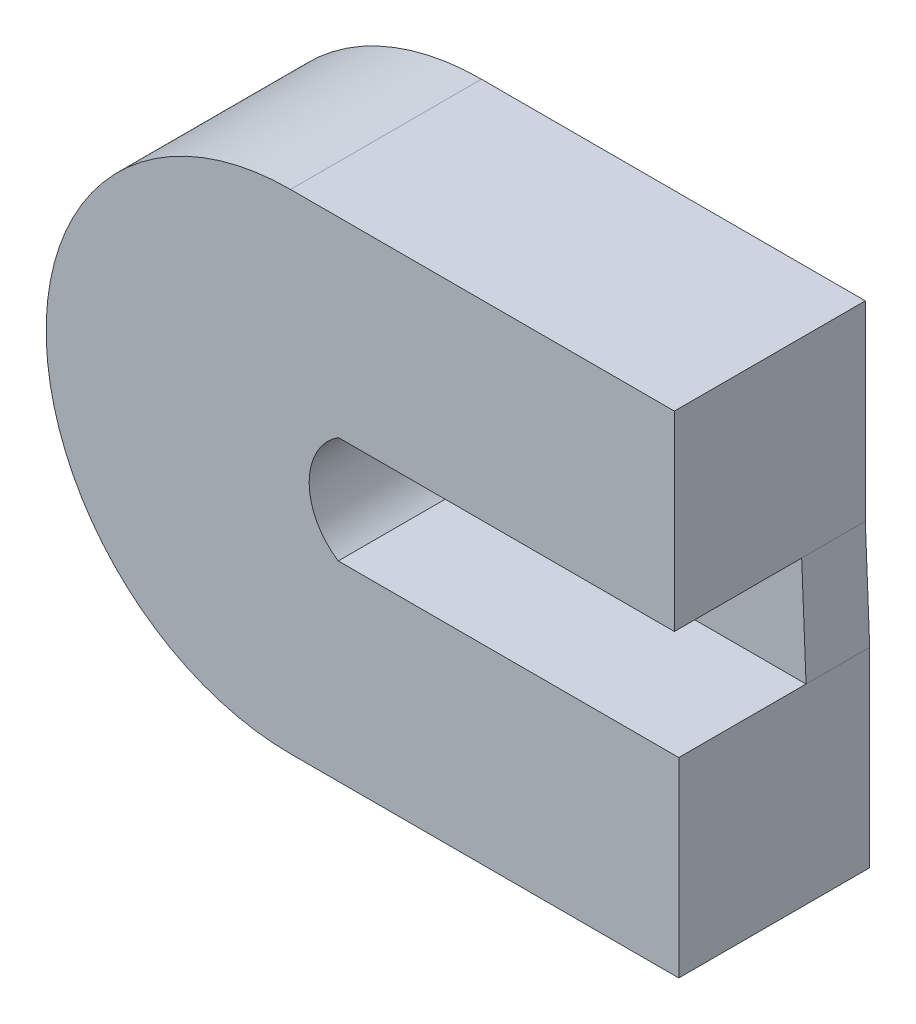
ISO-10303-21;
HEADER;
FILE_DESCRIPTION(('STEP AP214'),'2;1');
FILE_NAME('part.step','',(''),(''),'','','');
FILE_SCHEMA(('AUTOMOTIVE_DESIGN { 1 0 10303 214 1 1 1 1 }'));
ENDSEC;
DATA;
#1=APPLICATION_CONTEXT('core data for automotive mechanical design processes');
#2=APPLICATION_PROTOCOL_DEFINITION('international standard','automotive_design',2000,#1);
#3=PRODUCT_CONTEXT('',#1,'mechanical');
#4=PRODUCT('Part','Part','',(#3));
#5=PRODUCT_RELATED_PRODUCT_CATEGORY('part','',(#4));
#6=PRODUCT_DEFINITION_FORMATION('','',#4);
#7=PRODUCT_DEFINITION_CONTEXT('part definition',#1,'design');
#8=PRODUCT_DEFINITION('design','',#6,#7);
#9=PRODUCT_DEFINITION_SHAPE('','',#8);
#10=(LENGTH_UNIT() NAMED_UNIT(*) SI_UNIT(.MILLI.,.METRE.));
#11=(NAMED_UNIT(*) PLANE_ANGLE_UNIT() SI_UNIT($,.RADIAN.));
#12=(NAMED_UNIT(*) SI_UNIT($,.STERADIAN.) SOLID_ANGLE_UNIT());
#13=UNCERTAINTY_MEASURE_WITH_UNIT(LENGTH_MEASURE(1.E-05),#10,'distance_accuracy_value','');
#14=(GEOMETRIC_REPRESENTATION_CONTEXT(3) GLOBAL_UNCERTAINTY_ASSIGNED_CONTEXT((#13)) GLOBAL_UNIT_ASSIGNED_CONTEXT((#10,
#11,#12)) REPRESENTATION_CONTEXT('',''));
#15=CARTESIAN_POINT('',(0.,0.,0.));
#16=DIRECTION('',(0.,0.,1.));
#17=DIRECTION('',(1.,0.,0.));
#18=AXIS2_PLACEMENT_3D('',#15,#16,#17);
#19=CARTESIAN_POINT('',(-2.,3.34542635658915,6.));
#20=DIRECTION('',(0.,-1.,0.));
#21=DIRECTION('',(0.,0.,-1.));
#22=AXIS2_PLACEMENT_3D('',#19,#20,#21);
#23=PLANE('',#22);
#24=DIRECTION('',(0.,0.,-1.));
#25=VECTOR('',#24,1.);
#26=CARTESIAN_POINT('',(2.7,3.34542635658915,2.));
#27=LINE('',#26,#25);
#28=CARTESIAN_POINT('',(2.7,3.34542635658915,2.));
#29=VERTEX_POINT('',#28);
#30=CARTESIAN_POINT('',(2.7,3.34542635658915,0.));
#31=VERTEX_POINT('',#30);
#32=EDGE_CURVE('E135',#29,#31,#27,.T.);
#33=ORIENTED_EDGE('',*,*,#32,.T.);
#34=DIRECTION('',(-1.,0.,0.));
#35=VECTOR('',#34,1.);
#36=CARTESIAN_POINT('',(-2.,3.34542635658915,0.));
#37=LINE('',#36,#35);
#38=CARTESIAN_POINT('',(-2.,3.34542635658915,0.));
#39=VERTEX_POINT('',#38);
#40=EDGE_CURVE('E122',#31,#39,#37,.T.);
#41=ORIENTED_EDGE('',*,*,#40,.T.);
#42=DIRECTION('',(0.,0.,-1.));
#43=VECTOR('',#42,1.);
#44=CARTESIAN_POINT('',(-2.,3.34542635658915,6.));
#45=LINE('',#44,#43);
#46=CARTESIAN_POINT('',(-2.,3.34542635658915,6.));
#47=VERTEX_POINT('',#46);
#48=EDGE_CURVE('E192',#47,#39,#45,.T.);
#49=ORIENTED_EDGE('',*,*,#48,.F.);
#50=DIRECTION('',(-1.,0.,0.));
#51=VECTOR('',#50,1.);
#52=CARTESIAN_POINT('',(8.70040378081228,3.34542635658915,6.));
#53=LINE('',#52,#51);
#54=CARTESIAN_POINT('',(8.70040378081228,3.34542635658915,6.));
#55=VERTEX_POINT('',#54);
#56=EDGE_CURVE('E168',#55,#47,#53,.T.);
#57=ORIENTED_EDGE('',*,*,#56,.F.);
#58=DIRECTION('',(0.,0.,-1.));
#59=VECTOR('',#58,1.);
#60=CARTESIAN_POINT('',(8.70040378081228,3.34542635658915,6.));
#61=LINE('',#60,#59);
#62=CARTESIAN_POINT('',(8.70040378081228,3.34542635658915,2.));
#63=VERTEX_POINT('',#62);
#64=EDGE_CURVE('E194',#55,#63,#61,.T.);
#65=ORIENTED_EDGE('',*,*,#64,.T.);
#66=DIRECTION('',(1.,0.,0.));
#67=VECTOR('',#66,1.);
#68=CARTESIAN_POINT('',(2.7,3.34542635658915,2.));
#69=LINE('',#68,#67);
#70=EDGE_CURVE('E52',#29,#63,#69,.T.);
#71=ORIENTED_EDGE('',*,*,#70,.F.);
#72=EDGE_LOOP('',(#33,#41,#49,#57,#65,#71));
#73=FACE_BOUND('',#72,.T.);
#74=ADVANCED_FACE('F37',(#73),#23,.F.);
#75=CARTESIAN_POINT('',(2.,6.70542635658915,6.));
#76=DIRECTION('',(0.,1.,0.));
#77=DIRECTION('',(0.,0.,1.));
#78=AXIS2_PLACEMENT_3D('',#75,#76,#77);
#79=PLANE('',#78);
#80=DIRECTION('',(0.,0.,-1.));
#81=VECTOR('',#80,1.);
#82=CARTESIAN_POINT('',(2.7,6.70542635658915,2.));
#83=LINE('',#82,#81);
#84=CARTESIAN_POINT('',(2.7,6.70542635658915,2.));
#85=VERTEX_POINT('',#84);
#86=CARTESIAN_POINT('',(2.7,6.70542635658915,0.));
#87=VERTEX_POINT('',#86);
#88=EDGE_CURVE('E138',#85,#87,#83,.T.);
#89=ORIENTED_EDGE('',*,*,#88,.F.);
#90=DIRECTION('',(-1.,0.,0.));
#91=VECTOR('',#90,1.);
#92=CARTESIAN_POINT('',(8.56254167416877,6.70542635658915,2.));
#93=LINE('',#92,#91);
#94=CARTESIAN_POINT('',(8.56254167416877,6.70542635658915,2.));
#95=VERTEX_POINT('',#94);
#96=EDGE_CURVE('E144',#95,#85,#93,.T.);
#97=ORIENTED_EDGE('',*,*,#96,.F.);
#98=DIRECTION('',(0.,0.,-1.));
#99=VECTOR('',#98,1.);
#100=CARTESIAN_POINT('',(8.56254167416877,6.70542635658915,6.));
#101=LINE('',#100,#99);
#102=CARTESIAN_POINT('',(8.56254167416877,6.70542635658915,6.));
#103=VERTEX_POINT('',#102);
#104=EDGE_CURVE('E174',#103,#95,#101,.T.);
#105=ORIENTED_EDGE('',*,*,#104,.F.);
#106=DIRECTION('',(1.,0.,0.));
#107=VECTOR('',#106,1.);
#108=CARTESIAN_POINT('',(-2.,6.70542635658915,6.));
#109=LINE('',#108,#107);
#110=CARTESIAN_POINT('',(-2.,6.70542635658915,6.));
#111=VERTEX_POINT('',#110);
#112=EDGE_CURVE('E172',#111,#103,#109,.T.);
#113=ORIENTED_EDGE('',*,*,#112,.F.);
#114=DIRECTION('',(0.,0.,-1.));
#115=VECTOR('',#114,1.);
#116=CARTESIAN_POINT('',(-2.,6.70542635658915,6.));
#117=LINE('',#116,#115);
#118=CARTESIAN_POINT('',(-2.,6.70542635658915,0.));
#119=VERTEX_POINT('',#118);
#120=EDGE_CURVE('E189',#111,#119,#117,.T.);
#121=ORIENTED_EDGE('',*,*,#120,.T.);
#122=DIRECTION('',(1.,0.,0.));
#123=VECTOR('',#122,1.);
#124=CARTESIAN_POINT('',(2.,6.70542635658915,0.));
#125=LINE('',#124,#123);
#126=EDGE_CURVE('E160',#119,#87,#125,.T.);
#127=ORIENTED_EDGE('',*,*,#126,.T.);
#128=EDGE_LOOP('',(#89,#97,#105,#113,#121,#127));
#129=FACE_BOUND('',#128,.T.);
#130=ADVANCED_FACE('F237',(#129),#79,.F.);
#131=CARTESIAN_POINT('',(8.56254167416877,6.70542635658915,6.));
#132=DIRECTION('',(-1.,0.,0.));
#133=DIRECTION('',(0.,0.,1.));
#134=AXIS2_PLACEMENT_3D('',#131,#132,#133);
#135=PLANE('',#134);
#136=DIRECTION('',(0.,1.,0.));
#137=VECTOR('',#136,1.);
#138=CARTESIAN_POINT('',(8.56254167416877,6.70542635658915,0.));
#139=LINE('',#138,#137);
#140=CARTESIAN_POINT('',(8.56254167416877,6.70542635658915,0.));
#141=VERTEX_POINT('',#140);
#142=CARTESIAN_POINT('',(8.56254167416877,12.7054263565891,0.));
#143=VERTEX_POINT('',#142);
#144=EDGE_CURVE('E155',#141,#143,#139,.T.);
#145=ORIENTED_EDGE('',*,*,#144,.T.);
#146=DIRECTION('',(0.,0.,-1.));
#147=VECTOR('',#146,1.);
#148=CARTESIAN_POINT('',(8.56254167416877,12.7054263565891,6.));
#149=LINE('',#148,#147);
#150=CARTESIAN_POINT('',(8.56254167416877,12.7054263565891,6.));
#151=VERTEX_POINT('',#150);
#152=EDGE_CURVE('E11',#151,#143,#149,.T.);
#153=ORIENTED_EDGE('',*,*,#152,.F.);
#154=DIRECTION('',(0.,1.,0.));
#155=VECTOR('',#154,1.);
#156=CARTESIAN_POINT('',(8.56254167416877,6.70542635658915,6.));
#157=LINE('',#156,#155);
#158=EDGE_CURVE('E156',#103,#151,#157,.T.);
#159=ORIENTED_EDGE('',*,*,#158,.F.);
#160=ORIENTED_EDGE('',*,*,#104,.T.);
#161=DIRECTION('',(0.,0.,-1.));
#162=VECTOR('',#161,1.);
#163=CARTESIAN_POINT('',(8.56254167416877,6.70542635658915,2.));
#164=LINE('',#163,#162);
#165=EDGE_CURVE('E150',#95,#141,#164,.T.);
#166=ORIENTED_EDGE('',*,*,#165,.T.);
#167=EDGE_LOOP('',(#145,#153,#159,#160,#166));
#168=FACE_BOUND('',#167,.T.);
#169=ADVANCED_FACE('F39',(#168),#135,.F.);
#170=CARTESIAN_POINT('',(-3.5,12.7054263565891,6.));
#171=DIRECTION('',(0.,-1.,0.));
#172=DIRECTION('',(0.,0.,-1.));
#173=AXIS2_PLACEMENT_3D('',#170,#171,#172);
#174=PLANE('',#173);
#175=DIRECTION('',(-1.,0.,0.));
#176=VECTOR('',#175,1.);
#177=CARTESIAN_POINT('',(-3.5,12.7054263565891,0.));
#178=LINE('',#177,#176);
#179=CARTESIAN_POINT('',(-3.5,12.7054263565891,0.));
#180=VERTEX_POINT('',#179);
#181=EDGE_CURVE('E177',#143,#180,#178,.T.);
#182=ORIENTED_EDGE('',*,*,#181,.T.);
#183=DIRECTION('',(0.,0.,-1.));
#184=VECTOR('',#183,1.);
#185=CARTESIAN_POINT('',(-3.5,12.7054263565891,6.));
#186=LINE('',#185,#184);
#187=CARTESIAN_POINT('',(-3.5,12.7054263565891,6.));
#188=VERTEX_POINT('',#187);
#189=EDGE_CURVE('E45',#188,#180,#186,.T.);
#190=ORIENTED_EDGE('',*,*,#189,.F.);
#191=DIRECTION('',(-1.,0.,0.));
#192=VECTOR('',#191,1.);
#193=CARTESIAN_POINT('',(8.56254167416877,12.7054263565891,6.));
#194=LINE('',#193,#192);
#195=EDGE_CURVE('E159',#151,#188,#194,.T.);
#196=ORIENTED_EDGE('',*,*,#195,.F.);
#197=ORIENTED_EDGE('',*,*,#152,.T.);
#198=EDGE_LOOP('',(#182,#190,#196,#197));
#199=FACE_BOUND('',#198,.T.);
#200=ADVANCED_FACE('F222',(#199),#174,.F.);
#201=CARTESIAN_POINT('',(-3.5,5.02542635658915,6.));
#202=DIRECTION('',(0.,0.,-1.));
#203=DIRECTION('',(-1.,0.,0.));
#204=AXIS2_PLACEMENT_3D('',#201,#202,#203);
#205=CYLINDRICAL_SURFACE('',#204,7.68);
#206=CARTESIAN_POINT('',(-3.5,5.02542635658915,0.));
#207=DIRECTION('',(0.,0.,1.));
#208=DIRECTION('',(-1.,0.,0.));
#209=AXIS2_PLACEMENT_3D('',#206,#207,#208);
#210=CIRCLE('',#209,7.68);
#211=CARTESIAN_POINT('',(-3.5,-2.65457364341085,0.));
#212=VERTEX_POINT('',#211);
#213=EDGE_CURVE('E179',#180,#212,#210,.T.);
#214=ORIENTED_EDGE('',*,*,#213,.T.);
#215=DIRECTION('',(0.,0.,-1.));
#216=VECTOR('',#215,1.);
#217=CARTESIAN_POINT('',(-3.5,-2.65457364341085,6.));
#218=LINE('',#217,#216);
#219=CARTESIAN_POINT('',(-3.5,-2.65457364341085,6.));
#220=VERTEX_POINT('',#219);
#221=EDGE_CURVE('E199',#220,#212,#218,.T.);
#222=ORIENTED_EDGE('',*,*,#221,.F.);
#223=CARTESIAN_POINT('',(-3.5,5.02542635658915,6.));
#224=DIRECTION('',(0.,0.,1.));
#225=DIRECTION('',(-1.,0.,0.));
#226=AXIS2_PLACEMENT_3D('',#223,#224,#225);
#227=CIRCLE('',#226,7.68);
#228=EDGE_CURVE('E162',#188,#220,#227,.T.);
#229=ORIENTED_EDGE('',*,*,#228,.F.);
#230=ORIENTED_EDGE('',*,*,#189,.T.);
#231=EDGE_LOOP('',(#214,#222,#229,#230));
#232=FACE_BOUND('',#231,.T.);
#233=ADVANCED_FACE('F206',(#232),#205,.T.);
#234=CARTESIAN_POINT('',(3.5,-2.65457364341085,6.));
#235=DIRECTION('',(0.,1.,0.));
#236=DIRECTION('',(-1.,0.,0.));
#237=AXIS2_PLACEMENT_3D('',#234,#235,#236);
#238=PLANE('',#237);
#239=DIRECTION('',(1.,0.,0.));
#240=VECTOR('',#239,1.);
#241=CARTESIAN_POINT('',(3.5,-2.65457364341085,0.));
#242=LINE('',#241,#240);
#243=CARTESIAN_POINT('',(8.70040378081228,-2.65457364341085,0.));
#244=VERTEX_POINT('',#243);
#245=EDGE_CURVE('E182',#212,#244,#242,.T.);
#246=ORIENTED_EDGE('',*,*,#245,.T.);
#247=DIRECTION('',(0.,0.,-1.));
#248=VECTOR('',#247,1.);
#249=CARTESIAN_POINT('',(8.70040378081228,-2.65457364341085,6.));
#250=LINE('',#249,#248);
#251=CARTESIAN_POINT('',(8.70040378081228,-2.65457364341085,6.));
#252=VERTEX_POINT('',#251);
#253=EDGE_CURVE('E196',#252,#244,#250,.T.);
#254=ORIENTED_EDGE('',*,*,#253,.F.);
#255=DIRECTION('',(1.,0.,0.));
#256=VECTOR('',#255,1.);
#257=CARTESIAN_POINT('',(3.5,-2.65457364341085,6.));
#258=LINE('',#257,#256);
#259=EDGE_CURVE('E164',#220,#252,#258,.T.);
#260=ORIENTED_EDGE('',*,*,#259,.F.);
#261=ORIENTED_EDGE('',*,*,#221,.T.);
#262=EDGE_LOOP('',(#246,#254,#260,#261));
#263=FACE_BOUND('',#262,.T.);
#264=ADVANCED_FACE('F213',(#263),#238,.F.);
#265=CARTESIAN_POINT('',(8.70040378081228,-2.65457364341085,6.));
#266=DIRECTION('',(-1.,0.,0.));
#267=DIRECTION('',(0.,0.,1.));
#268=AXIS2_PLACEMENT_3D('',#265,#266,#267);
#269=PLANE('',#268);
#270=DIRECTION('',(0.,1.,0.));
#271=VECTOR('',#270,1.);
#272=CARTESIAN_POINT('',(8.70040378081228,-2.65457364341085,0.));
#273=LINE('',#272,#271);
#274=CARTESIAN_POINT('',(8.70040378081228,3.34542635658915,0.));
#275=VERTEX_POINT('',#274);
#276=EDGE_CURVE('E132',#244,#275,#273,.T.);
#277=ORIENTED_EDGE('',*,*,#276,.T.);
#278=DIRECTION('',(0.,0.,-1.));
#279=VECTOR('',#278,1.);
#280=CARTESIAN_POINT('',(8.70040378081228,3.34542635658915,2.));
#281=LINE('',#280,#279);
#282=EDGE_CURVE('E60',#63,#275,#281,.T.);
#283=ORIENTED_EDGE('',*,*,#282,.F.);
#284=ORIENTED_EDGE('',*,*,#64,.F.);
#285=DIRECTION('',(0.,1.,0.));
#286=VECTOR('',#285,1.);
#287=CARTESIAN_POINT('',(8.70040378081228,-2.65457364341085,6.));
#288=LINE('',#287,#286);
#289=EDGE_CURVE('E166',#252,#55,#288,.T.);
#290=ORIENTED_EDGE('',*,*,#289,.F.);
#291=ORIENTED_EDGE('',*,*,#253,.T.);
#292=EDGE_LOOP('',(#277,#283,#284,#290,#291));
#293=FACE_BOUND('',#292,.T.);
#294=ADVANCED_FACE('F216',(#293),#269,.F.);
#295=CARTESIAN_POINT('',(-0.914827202699956,5.02542635658915,6.));
#296=DIRECTION('',(0.,0.,-1.));
#297=DIRECTION('',(-1.,0.,0.));
#298=AXIS2_PLACEMENT_3D('',#295,#296,#297);
#299=CYLINDRICAL_SURFACE('',#298,2.);
#300=CARTESIAN_POINT('',(-0.914827202699956,5.02542635658915,0.));
#301=DIRECTION('',(0.,0.,-1.));
#302=DIRECTION('',(1.,0.,0.));
#303=AXIS2_PLACEMENT_3D('',#300,#301,#302);
#304=CIRCLE('',#303,2.);
#305=EDGE_CURVE('E129',#39,#119,#304,.T.);
#306=ORIENTED_EDGE('',*,*,#305,.T.);
#307=ORIENTED_EDGE('',*,*,#120,.F.);
#308=CARTESIAN_POINT('',(-0.914827202699956,5.02542635658915,6.));
#309=DIRECTION('',(0.,0.,-1.));
#310=DIRECTION('',(1.,0.,0.));
#311=AXIS2_PLACEMENT_3D('',#308,#309,#310);
#312=CIRCLE('',#311,2.);
#313=EDGE_CURVE('E170',#47,#111,#312,.T.);
#314=ORIENTED_EDGE('',*,*,#313,.F.);
#315=ORIENTED_EDGE('',*,*,#48,.T.);
#316=EDGE_LOOP('',(#306,#307,#314,#315));
#317=FACE_BOUND('',#316,.T.);
#318=ADVANCED_FACE('F241',(#317),#299,.F.);
#319=CARTESIAN_POINT('',(-3.5,5.02542635658915,6.));
#320=DIRECTION('',(0.,0.,-1.));
#321=DIRECTION('',(-1.,0.,0.));
#322=AXIS2_PLACEMENT_3D('',#319,#320,#321);
#323=PLANE('',#322);
#324=ORIENTED_EDGE('',*,*,#158,.T.);
#325=ORIENTED_EDGE('',*,*,#195,.T.);
#326=ORIENTED_EDGE('',*,*,#228,.T.);
#327=ORIENTED_EDGE('',*,*,#259,.T.);
#328=ORIENTED_EDGE('',*,*,#289,.T.);
#329=ORIENTED_EDGE('',*,*,#56,.T.);
#330=ORIENTED_EDGE('',*,*,#313,.T.);
#331=ORIENTED_EDGE('',*,*,#112,.T.);
#332=EDGE_LOOP('',(#324,#325,#326,#327,#328,#329,#330,#331));
#333=FACE_BOUND('',#332,.T.);
#334=ADVANCED_FACE('F219',(#333),#323,.F.);
#335=CARTESIAN_POINT('',(-3.5,5.02542635658915,0.));
#336=DIRECTION('',(0.,0.,-1.));
#337=DIRECTION('',(-1.,0.,0.));
#338=AXIS2_PLACEMENT_3D('',#335,#336,#337);
#339=PLANE('',#338);
#340=DIRECTION('',(0.,-1.,0.));
#341=VECTOR('',#340,1.);
#342=CARTESIAN_POINT('',(2.7,6.70542635658915,0.));
#343=LINE('',#342,#341);
#344=EDGE_CURVE('E126',#87,#31,#343,.T.);
#345=ORIENTED_EDGE('',*,*,#344,.F.);
#346=ORIENTED_EDGE('',*,*,#126,.F.);
#347=ORIENTED_EDGE('',*,*,#305,.F.);
#348=ORIENTED_EDGE('',*,*,#40,.F.);
#349=EDGE_LOOP('',(#345,#346,#347,#348));
#350=FACE_BOUND('',#349,.T.);
#351=ORIENTED_EDGE('',*,*,#144,.F.);
#352=DIRECTION('',(-0.0409958952458569,0.999159314910786,0.));
#353=VECTOR('',#352,1.);
#354=CARTESIAN_POINT('',(8.56254167416877,6.70542635658915,0.));
#355=LINE('',#354,#353);
#356=EDGE_CURVE('E141',#275,#141,#355,.T.);
#357=ORIENTED_EDGE('',*,*,#356,.F.);
#358=ORIENTED_EDGE('',*,*,#276,.F.);
#359=ORIENTED_EDGE('',*,*,#245,.F.);
#360=ORIENTED_EDGE('',*,*,#213,.F.);
#361=ORIENTED_EDGE('',*,*,#181,.F.);
#362=EDGE_LOOP('',(#351,#357,#358,#359,#360,#361));
#363=FACE_BOUND('',#362,.T.);
#364=ADVANCED_FACE('F123',(#350,#363),#339,.T.);
#365=CARTESIAN_POINT('',(2.7,6.70542635658915,2.));
#366=DIRECTION('',(1.,0.,0.));
#367=DIRECTION('',(0.,0.,-1.));
#368=AXIS2_PLACEMENT_3D('',#365,#366,#367);
#369=PLANE('',#368);
#370=ORIENTED_EDGE('',*,*,#344,.T.);
#371=ORIENTED_EDGE('',*,*,#32,.F.);
#372=DIRECTION('',(0.,-1.,0.));
#373=VECTOR('',#372,1.);
#374=CARTESIAN_POINT('',(2.7,6.70542635658915,2.));
#375=LINE('',#374,#373);
#376=EDGE_CURVE('E231',#85,#29,#375,.T.);
#377=ORIENTED_EDGE('',*,*,#376,.F.);
#378=ORIENTED_EDGE('',*,*,#88,.T.);
#379=EDGE_LOOP('',(#370,#371,#377,#378));
#380=FACE_BOUND('',#379,.T.);
#381=ADVANCED_FACE('F140',(#380),#369,.F.);
#382=CARTESIAN_POINT('',(8.56254167416877,6.70542635658915,2.));
#383=DIRECTION('',(-0.999159314910786,-0.0409958952458569,0.));
#384=DIRECTION('',(0.0409958952458569,-0.999159314910786,0.));
#385=AXIS2_PLACEMENT_3D('',#382,#383,#384);
#386=PLANE('',#385);
#387=ORIENTED_EDGE('',*,*,#356,.T.);
#388=ORIENTED_EDGE('',*,*,#165,.F.);
#389=DIRECTION('',(-0.0409958952458569,0.999159314910786,0.));
#390=VECTOR('',#389,1.);
#391=CARTESIAN_POINT('',(8.56254167416877,6.70542635658915,2.));
#392=LINE('',#391,#390);
#393=EDGE_CURVE('E147',#63,#95,#392,.T.);
#394=ORIENTED_EDGE('',*,*,#393,.F.);
#395=ORIENTED_EDGE('',*,*,#282,.T.);
#396=EDGE_LOOP('',(#387,#388,#394,#395));
#397=FACE_BOUND('',#396,.T.);
#398=ADVANCED_FACE('F226',(#397),#386,.F.);
#399=CARTESIAN_POINT('',(0.,0.,2.));
#400=DIRECTION('',(0.,0.,1.));
#401=DIRECTION('',(1.,0.,0.));
#402=AXIS2_PLACEMENT_3D('',#399,#400,#401);
#403=PLANE('',#402);
#404=ORIENTED_EDGE('',*,*,#96,.T.);
#405=ORIENTED_EDGE('',*,*,#376,.T.);
#406=ORIENTED_EDGE('',*,*,#70,.T.);
#407=ORIENTED_EDGE('',*,*,#393,.T.);
#408=EDGE_LOOP('',(#404,#405,#406,#407));
#409=FACE_BOUND('',#408,.T.);
#410=ADVANCED_FACE('F234',(#409),#403,.T.);
#411=CLOSED_SHELL('',(#74,#130,#169,#200,#233,#264,#294,#318,#334,#364,#381,#398,#410));
#412=MANIFOLD_SOLID_BREP('B2',#411);
#413=ADVANCED_BREP_SHAPE_REPRESENTATION('',(#18,#412),#14);
#414=SHAPE_DEFINITION_REPRESENTATION(#9,#413);
ENDSEC;
END-ISO-10303-21;
